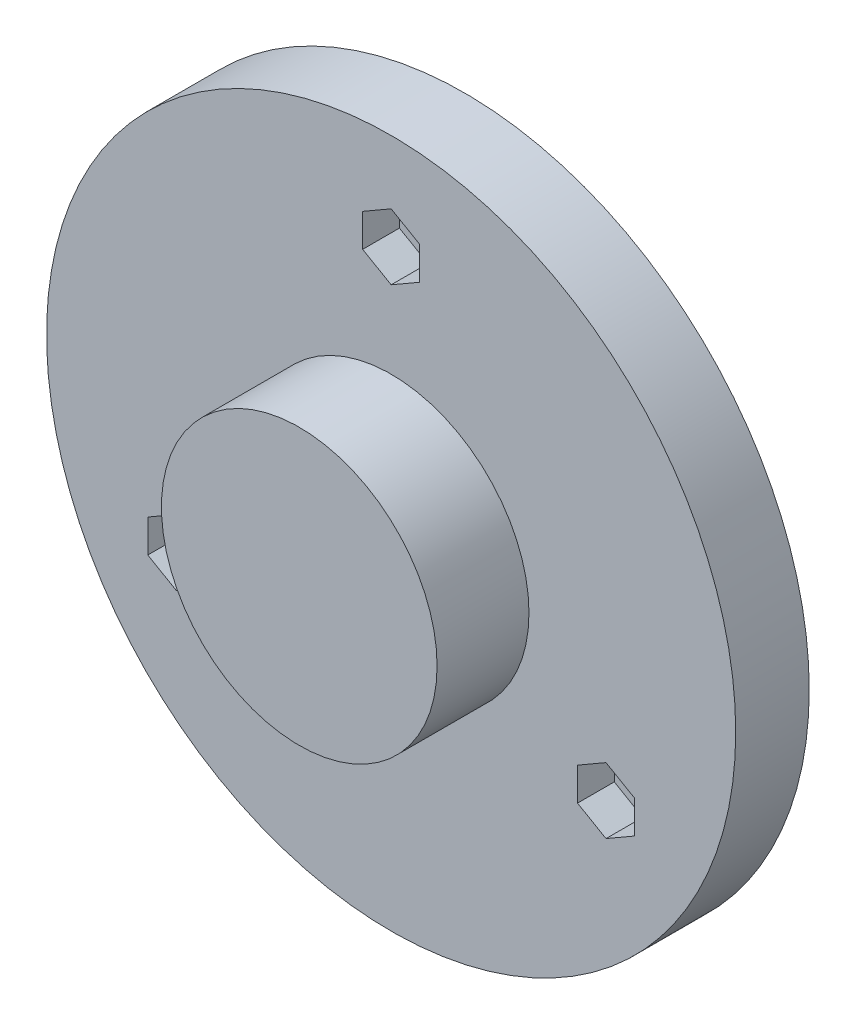
ISO-10303-21;
HEADER;
FILE_DESCRIPTION(('STEP AP214'),'2;1');
FILE_NAME('part.step','',(''),(''),'','','');
FILE_SCHEMA(('AUTOMOTIVE_DESIGN { 1 0 10303 214 1 1 1 1 }'));
ENDSEC;
DATA;
#1=APPLICATION_CONTEXT('core data for automotive mechanical design processes');
#2=APPLICATION_PROTOCOL_DEFINITION('international standard','automotive_design',2000,#1);
#3=PRODUCT_CONTEXT('',#1,'mechanical');
#4=PRODUCT('Part','Part','',(#3));
#5=PRODUCT_RELATED_PRODUCT_CATEGORY('part','',(#4));
#6=PRODUCT_DEFINITION_FORMATION('','',#4);
#7=PRODUCT_DEFINITION_CONTEXT('part definition',#1,'design');
#8=PRODUCT_DEFINITION('design','',#6,#7);
#9=PRODUCT_DEFINITION_SHAPE('','',#8);
#10=(LENGTH_UNIT() NAMED_UNIT(*) SI_UNIT(.MILLI.,.METRE.));
#11=(NAMED_UNIT(*) PLANE_ANGLE_UNIT() SI_UNIT($,.RADIAN.));
#12=(NAMED_UNIT(*) SI_UNIT($,.STERADIAN.) SOLID_ANGLE_UNIT());
#13=UNCERTAINTY_MEASURE_WITH_UNIT(LENGTH_MEASURE(1.E-05),#10,'distance_accuracy_value','');
#14=(GEOMETRIC_REPRESENTATION_CONTEXT(3) GLOBAL_UNCERTAINTY_ASSIGNED_CONTEXT((#13)) GLOBAL_UNIT_ASSIGNED_CONTEXT((#10,
#11,#12)) REPRESENTATION_CONTEXT('',''));
#15=CARTESIAN_POINT('',(0.,0.,0.));
#16=DIRECTION('',(0.,0.,1.));
#17=DIRECTION('',(1.,0.,0.));
#18=AXIS2_PLACEMENT_3D('',#15,#16,#17);
#19=CARTESIAN_POINT('',(0.,0.,8.));
#20=DIRECTION('',(0.,0.,-1.));
#21=DIRECTION('',(-1.,0.,0.));
#22=AXIS2_PLACEMENT_3D('',#19,#20,#21);
#23=CYLINDRICAL_SURFACE('',#22,37.5);
#24=CARTESIAN_POINT('',(0.,0.,8.));
#25=DIRECTION('',(0.,0.,1.));
#26=DIRECTION('',(1.,0.,0.));
#27=AXIS2_PLACEMENT_3D('',#24,#25,#26);
#28=CIRCLE('',#27,37.5);
#29=CARTESIAN_POINT('',(37.5,0.,8.));
#30=VERTEX_POINT('',#29);
#31=EDGE_CURVE('E48',#30,#30,#28,.T.);
#32=ORIENTED_EDGE('',*,*,#31,.F.);
#33=EDGE_LOOP('',(#32));
#34=FACE_BOUND('',#33,.T.);
#35=CARTESIAN_POINT('',(0.,0.,0.));
#36=DIRECTION('',(0.,0.,1.));
#37=DIRECTION('',(1.,0.,0.));
#38=AXIS2_PLACEMENT_3D('',#35,#36,#37);
#39=CIRCLE('',#38,37.5);
#40=CARTESIAN_POINT('',(37.5,0.,0.));
#41=VERTEX_POINT('',#40);
#42=EDGE_CURVE('E357',#41,#41,#39,.T.);
#43=ORIENTED_EDGE('',*,*,#42,.T.);
#44=EDGE_LOOP('',(#43));
#45=FACE_BOUND('',#44,.T.);
#46=ADVANCED_FACE('F39',(#34,#45),#23,.T.);
#47=CARTESIAN_POINT('',(0.,0.,8.));
#48=DIRECTION('',(0.,0.,1.));
#49=DIRECTION('',(1.,0.,0.));
#50=AXIS2_PLACEMENT_3D('',#47,#48,#49);
#51=PLANE('',#50);
#52=CARTESIAN_POINT('',(0.,0.,8.));
#53=DIRECTION('',(0.,0.,1.));
#54=DIRECTION('',(1.,0.,0.));
#55=AXIS2_PLACEMENT_3D('',#52,#53,#54);
#56=CIRCLE('',#55,15.);
#57=CARTESIAN_POINT('',(15.,0.,8.));
#58=VERTEX_POINT('',#57);
#59=EDGE_CURVE('E11',#58,#58,#56,.T.);
#60=ORIENTED_EDGE('',*,*,#59,.F.);
#61=EDGE_LOOP('',(#60));
#62=FACE_BOUND('',#61,.T.);
#63=DIRECTION('',(0.,1.,0.));
#64=VECTOR('',#63,1.);
#65=CARTESIAN_POINT('',(-20.2823149566315,-15.2900000000001,8.));
#66=LINE('',#65,#64);
#67=CARTESIAN_POINT('',(-20.2823149566315,-15.2900000000001,8.));
#68=VERTEX_POINT('',#67);
#69=CARTESIAN_POINT('',(-20.2823149566315,-11.7100000000001,8.));
#70=VERTEX_POINT('',#69);
#71=EDGE_CURVE('E56',#68,#70,#66,.T.);
#72=ORIENTED_EDGE('',*,*,#71,.F.);
#73=DIRECTION('',(0.866025403784437,0.500000000000004,0.));
#74=VECTOR('',#73,1.);
#75=CARTESIAN_POINT('',(-23.3826859021798,-17.0800000000001,8.));
#76=LINE('',#75,#74);
#77=CARTESIAN_POINT('',(-23.3826859021798,-17.0800000000001,8.));
#78=VERTEX_POINT('',#77);
#79=EDGE_CURVE('E190',#78,#68,#76,.T.);
#80=ORIENTED_EDGE('',*,*,#79,.F.);
#81=DIRECTION('',(0.866025403784441,-0.499999999999996,0.));
#82=VECTOR('',#81,1.);
#83=CARTESIAN_POINT('',(-26.4830568477281,-15.2900000000001,8.));
#84=LINE('',#83,#82);
#85=CARTESIAN_POINT('',(-26.4830568477281,-15.2900000000001,8.));
#86=VERTEX_POINT('',#85);
#87=EDGE_CURVE('E194',#86,#78,#84,.T.);
#88=ORIENTED_EDGE('',*,*,#87,.F.);
#89=DIRECTION('',(0.,-1.,0.));
#90=VECTOR('',#89,1.);
#91=CARTESIAN_POINT('',(-26.4830568477281,-11.7100000000001,8.));
#92=LINE('',#91,#90);
#93=CARTESIAN_POINT('',(-26.4830568477281,-11.7100000000001,8.));
#94=VERTEX_POINT('',#93);
#95=EDGE_CURVE('E221',#94,#86,#92,.T.);
#96=ORIENTED_EDGE('',*,*,#95,.F.);
#97=DIRECTION('',(-0.866025403784436,-0.500000000000004,0.));
#98=VECTOR('',#97,1.);
#99=CARTESIAN_POINT('',(-23.3826859021798,-9.92000000000011,8.));
#100=LINE('',#99,#98);
#101=CARTESIAN_POINT('',(-23.3826859021798,-9.92000000000011,8.));
#102=VERTEX_POINT('',#101);
#103=EDGE_CURVE('E217',#102,#94,#100,.T.);
#104=ORIENTED_EDGE('',*,*,#103,.F.);
#105=DIRECTION('',(-0.866025403784441,0.499999999999995,0.));
#106=VECTOR('',#105,1.);
#107=CARTESIAN_POINT('',(-20.2823149566315,-11.7100000000001,8.));
#108=LINE('',#107,#106);
#109=EDGE_CURVE('E213',#70,#102,#108,.T.);
#110=ORIENTED_EDGE('',*,*,#109,.F.);
#111=EDGE_LOOP('',(#72,#80,#88,#96,#104,#110));
#112=FACE_BOUND('',#111,.T.);
#113=DIRECTION('',(-0.866025403784434,-0.500000000000008,0.));
#114=VECTOR('',#113,1.);
#115=CARTESIAN_POINT('',(23.3826859021799,-9.91999999999978,8.));
#116=LINE('',#115,#114);
#117=CARTESIAN_POINT('',(23.3826859021799,-9.91999999999978,8.));
#118=VERTEX_POINT('',#117);
#119=CARTESIAN_POINT('',(20.2823149566317,-11.7099999999998,8.));
#120=VERTEX_POINT('',#119);
#121=EDGE_CURVE('E64',#118,#120,#116,.T.);
#122=ORIENTED_EDGE('',*,*,#121,.F.);
#123=DIRECTION('',(-0.866025403784443,0.499999999999992,0.));
#124=VECTOR('',#123,1.);
#125=CARTESIAN_POINT('',(26.4830568477282,-11.7099999999998,8.));
#126=LINE('',#125,#124);
#127=CARTESIAN_POINT('',(26.4830568477282,-11.7099999999998,8.));
#128=VERTEX_POINT('',#127);
#129=EDGE_CURVE('E248',#128,#118,#126,.T.);
#130=ORIENTED_EDGE('',*,*,#129,.F.);
#131=DIRECTION('',(0.,1.,0.));
#132=VECTOR('',#131,1.);
#133=CARTESIAN_POINT('',(26.4830568477283,-15.2899999999998,8.));
#134=LINE('',#133,#132);
#135=CARTESIAN_POINT('',(26.4830568477283,-15.2899999999998,8.));
#136=VERTEX_POINT('',#135);
#137=EDGE_CURVE('E284',#136,#128,#134,.T.);
#138=ORIENTED_EDGE('',*,*,#137,.F.);
#139=DIRECTION('',(0.866025403784434,0.500000000000008,0.));
#140=VECTOR('',#139,1.);
#141=CARTESIAN_POINT('',(23.38268590218,-17.0799999999998,8.));
#142=LINE('',#141,#140);
#143=CARTESIAN_POINT('',(23.38268590218,-17.0799999999998,8.));
#144=VERTEX_POINT('',#143);
#145=EDGE_CURVE('E280',#144,#136,#142,.T.);
#146=ORIENTED_EDGE('',*,*,#145,.F.);
#147=DIRECTION('',(0.866025403784443,-0.499999999999992,0.));
#148=VECTOR('',#147,1.);
#149=CARTESIAN_POINT('',(20.2823149566317,-15.2899999999998,8.));
#150=LINE('',#149,#148);
#151=CARTESIAN_POINT('',(20.2823149566317,-15.2899999999998,8.));
#152=VERTEX_POINT('',#151);
#153=EDGE_CURVE('E276',#152,#144,#150,.T.);
#154=ORIENTED_EDGE('',*,*,#153,.F.);
#155=DIRECTION('',(0.,-1.,0.));
#156=VECTOR('',#155,1.);
#157=CARTESIAN_POINT('',(20.2823149566317,-11.7099999999998,8.));
#158=LINE('',#157,#156);
#159=EDGE_CURVE('E271',#120,#152,#158,.T.);
#160=ORIENTED_EDGE('',*,*,#159,.F.);
#161=EDGE_LOOP('',(#122,#130,#138,#146,#154,#160));
#162=FACE_BOUND('',#161,.T.);
#163=DIRECTION('',(0.866025403784438,-0.5,0.));
#164=VECTOR('',#163,1.);
#165=CARTESIAN_POINT('',(-3.10037094554829,25.21,8.));
#166=LINE('',#165,#164);
#167=CARTESIAN_POINT('',(-3.10037094554829,25.21,8.));
#168=VERTEX_POINT('',#167);
#169=CARTESIAN_POINT('',(0.,23.42,8.));
#170=VERTEX_POINT('',#169);
#171=EDGE_CURVE('E231',#168,#170,#166,.T.);
#172=ORIENTED_EDGE('',*,*,#171,.F.);
#173=DIRECTION('',(0.,-1.,0.));
#174=VECTOR('',#173,1.);
#175=CARTESIAN_POINT('',(-3.10037094554829,28.79,8.));
#176=LINE('',#175,#174);
#177=CARTESIAN_POINT('',(-3.10037094554829,28.79,8.));
#178=VERTEX_POINT('',#177);
#179=EDGE_CURVE('E312',#178,#168,#176,.T.);
#180=ORIENTED_EDGE('',*,*,#179,.F.);
#181=DIRECTION('',(-0.866025403784439,-0.5,0.));
#182=VECTOR('',#181,1.);
#183=CARTESIAN_POINT('',(0.,30.58,8.));
#184=LINE('',#183,#182);
#185=CARTESIAN_POINT('',(0.,30.58,8.));
#186=VERTEX_POINT('',#185);
#187=EDGE_CURVE('E347',#186,#178,#184,.T.);
#188=ORIENTED_EDGE('',*,*,#187,.F.);
#189=DIRECTION('',(-0.866025403784439,0.5,0.));
#190=VECTOR('',#189,1.);
#191=CARTESIAN_POINT('',(3.10037094554829,28.79,8.));
#192=LINE('',#191,#190);
#193=CARTESIAN_POINT('',(3.10037094554829,28.79,8.));
#194=VERTEX_POINT('',#193);
#195=EDGE_CURVE('E343',#194,#186,#192,.T.);
#196=ORIENTED_EDGE('',*,*,#195,.F.);
#197=DIRECTION('',(0.,1.,0.));
#198=VECTOR('',#197,1.);
#199=CARTESIAN_POINT('',(3.10037094554829,25.21,8.));
#200=LINE('',#199,#198);
#201=CARTESIAN_POINT('',(3.10037094554829,25.21,8.));
#202=VERTEX_POINT('',#201);
#203=EDGE_CURVE('E339',#202,#194,#200,.T.);
#204=ORIENTED_EDGE('',*,*,#203,.F.);
#205=DIRECTION('',(0.866025403784438,0.500000000000001,0.));
#206=VECTOR('',#205,1.);
#207=CARTESIAN_POINT('',(0.,23.42,8.));
#208=LINE('',#207,#206);
#209=EDGE_CURVE('E335',#170,#202,#208,.T.);
#210=ORIENTED_EDGE('',*,*,#209,.F.);
#211=EDGE_LOOP('',(#172,#180,#188,#196,#204,#210));
#212=FACE_BOUND('',#211,.T.);
#213=ORIENTED_EDGE('',*,*,#31,.T.);
#214=EDGE_LOOP('',(#213));
#215=FACE_BOUND('',#214,.T.);
#216=ADVANCED_FACE('F412',(#62,#112,#162,#212,#215),#51,.T.);
#217=CARTESIAN_POINT('',(0.,0.,0.));
#218=DIRECTION('',(0.,0.,1.));
#219=DIRECTION('',(1.,0.,0.));
#220=AXIS2_PLACEMENT_3D('',#217,#218,#219);
#221=PLANE('',#220);
#222=CARTESIAN_POINT('',(-23.3826859021798,-13.5000000000001,0.));
#223=DIRECTION('',(0.,0.,1.));
#224=DIRECTION('',(1.,0.,0.));
#225=AXIS2_PLACEMENT_3D('',#222,#223,#224);
#226=CIRCLE('',#225,1.75);
#227=CARTESIAN_POINT('',(-21.6326859021798,-13.5000000000001,0.));
#228=VERTEX_POINT('',#227);
#229=EDGE_CURVE('E42',#228,#228,#226,.T.);
#230=ORIENTED_EDGE('',*,*,#229,.T.);
#231=EDGE_LOOP('',(#230));
#232=FACE_BOUND('',#231,.T.);
#233=CARTESIAN_POINT('',(23.38268590218,-13.4999999999998,0.));
#234=DIRECTION('',(0.,0.,1.));
#235=DIRECTION('',(1.,0.,0.));
#236=AXIS2_PLACEMENT_3D('',#233,#234,#235);
#237=CIRCLE('',#236,1.75);
#238=CARTESIAN_POINT('',(25.13268590218,-13.4999999999998,0.));
#239=VERTEX_POINT('',#238);
#240=EDGE_CURVE('E381',#239,#239,#237,.T.);
#241=ORIENTED_EDGE('',*,*,#240,.T.);
#242=EDGE_LOOP('',(#241));
#243=FACE_BOUND('',#242,.T.);
#244=CARTESIAN_POINT('',(0.,27.,0.));
#245=DIRECTION('',(0.,0.,1.));
#246=DIRECTION('',(1.,0.,0.));
#247=AXIS2_PLACEMENT_3D('',#244,#245,#246);
#248=CIRCLE('',#247,1.75);
#249=CARTESIAN_POINT('',(1.75,27.,0.));
#250=VERTEX_POINT('',#249);
#251=EDGE_CURVE('E272',#250,#250,#248,.T.);
#252=ORIENTED_EDGE('',*,*,#251,.T.);
#253=EDGE_LOOP('',(#252));
#254=FACE_BOUND('',#253,.T.);
#255=ORIENTED_EDGE('',*,*,#42,.F.);
#256=EDGE_LOOP('',(#255));
#257=FACE_BOUND('',#256,.T.);
#258=ADVANCED_FACE('F415',(#232,#243,#254,#257),#221,.F.);
#259=CARTESIAN_POINT('',(-3.10037094554829,25.21,4.));
#260=DIRECTION('',(-0.5,-0.866025403784438,0.));
#261=DIRECTION('',(0.866025403784438,-0.5,0.));
#262=AXIS2_PLACEMENT_3D('',#259,#260,#261);
#263=PLANE('',#262);
#264=ORIENTED_EDGE('',*,*,#171,.T.);
#265=DIRECTION('',(0.,0.,1.));
#266=VECTOR('',#265,1.);
#267=CARTESIAN_POINT('',(0.,23.42,4.));
#268=LINE('',#267,#266);
#269=CARTESIAN_POINT('',(0.,23.42,4.));
#270=VERTEX_POINT('',#269);
#271=EDGE_CURVE('E332',#270,#170,#268,.T.);
#272=ORIENTED_EDGE('',*,*,#271,.F.);
#273=DIRECTION('',(0.866025403784438,-0.5,0.));
#274=VECTOR('',#273,1.);
#275=CARTESIAN_POINT('',(-3.10037094554829,25.21,4.));
#276=LINE('',#275,#274);
#277=CARTESIAN_POINT('',(-3.10037094554829,25.21,4.));
#278=VERTEX_POINT('',#277);
#279=EDGE_CURVE('E307',#278,#270,#276,.T.);
#280=ORIENTED_EDGE('',*,*,#279,.F.);
#281=DIRECTION('',(0.,0.,1.));
#282=VECTOR('',#281,1.);
#283=CARTESIAN_POINT('',(-3.10037094554829,25.21,4.));
#284=LINE('',#283,#282);
#285=EDGE_CURVE('E354',#278,#168,#284,.T.);
#286=ORIENTED_EDGE('',*,*,#285,.T.);
#287=EDGE_LOOP('',(#264,#272,#280,#286));
#288=FACE_BOUND('',#287,.T.);
#289=ADVANCED_FACE('F433',(#288),#263,.F.);
#290=CARTESIAN_POINT('',(-3.10037094554829,28.79,4.));
#291=DIRECTION('',(-1.,0.,0.));
#292=DIRECTION('',(0.,-1.,0.));
#293=AXIS2_PLACEMENT_3D('',#290,#291,#292);
#294=PLANE('',#293);
#295=ORIENTED_EDGE('',*,*,#179,.T.);
#296=ORIENTED_EDGE('',*,*,#285,.F.);
#297=DIRECTION('',(0.,-1.,0.));
#298=VECTOR('',#297,1.);
#299=CARTESIAN_POINT('',(-3.10037094554829,28.79,4.));
#300=LINE('',#299,#298);
#301=CARTESIAN_POINT('',(-3.10037094554829,28.79,4.));
#302=VERTEX_POINT('',#301);
#303=EDGE_CURVE('E328',#302,#278,#300,.T.);
#304=ORIENTED_EDGE('',*,*,#303,.F.);
#305=DIRECTION('',(0.,0.,1.));
#306=VECTOR('',#305,1.);
#307=CARTESIAN_POINT('',(-3.10037094554829,28.79,4.));
#308=LINE('',#307,#306);
#309=EDGE_CURVE('E358',#302,#178,#308,.T.);
#310=ORIENTED_EDGE('',*,*,#309,.T.);
#311=EDGE_LOOP('',(#295,#296,#304,#310));
#312=FACE_BOUND('',#311,.T.);
#313=ADVANCED_FACE('F438',(#312),#294,.F.);
#314=CARTESIAN_POINT('',(0.,30.58,4.));
#315=DIRECTION('',(-0.5,0.866025403784439,0.));
#316=DIRECTION('',(-0.866025403784439,-0.5,0.));
#317=AXIS2_PLACEMENT_3D('',#314,#315,#316);
#318=PLANE('',#317);
#319=ORIENTED_EDGE('',*,*,#187,.T.);
#320=ORIENTED_EDGE('',*,*,#309,.F.);
#321=DIRECTION('',(-0.866025403784439,-0.5,0.));
#322=VECTOR('',#321,1.);
#323=CARTESIAN_POINT('',(0.,30.58,4.));
#324=LINE('',#323,#322);
#325=CARTESIAN_POINT('',(0.,30.58,4.));
#326=VERTEX_POINT('',#325);
#327=EDGE_CURVE('E324',#326,#302,#324,.T.);
#328=ORIENTED_EDGE('',*,*,#327,.F.);
#329=DIRECTION('',(0.,0.,1.));
#330=VECTOR('',#329,1.);
#331=CARTESIAN_POINT('',(0.,30.58,4.));
#332=LINE('',#331,#330);
#333=EDGE_CURVE('E361',#326,#186,#332,.T.);
#334=ORIENTED_EDGE('',*,*,#333,.T.);
#335=EDGE_LOOP('',(#319,#320,#328,#334));
#336=FACE_BOUND('',#335,.T.);
#337=ADVANCED_FACE('F454',(#336),#318,.F.);
#338=CARTESIAN_POINT('',(3.10037094554829,28.79,4.));
#339=DIRECTION('',(0.5,0.866025403784439,0.));
#340=DIRECTION('',(-0.866025403784439,0.5,0.));
#341=AXIS2_PLACEMENT_3D('',#338,#339,#340);
#342=PLANE('',#341);
#343=ORIENTED_EDGE('',*,*,#195,.T.);
#344=ORIENTED_EDGE('',*,*,#333,.F.);
#345=DIRECTION('',(-0.866025403784439,0.5,0.));
#346=VECTOR('',#345,1.);
#347=CARTESIAN_POINT('',(3.10037094554829,28.79,4.));
#348=LINE('',#347,#346);
#349=CARTESIAN_POINT('',(3.10037094554829,28.79,4.));
#350=VERTEX_POINT('',#349);
#351=EDGE_CURVE('E320',#350,#326,#348,.T.);
#352=ORIENTED_EDGE('',*,*,#351,.F.);
#353=DIRECTION('',(0.,0.,1.));
#354=VECTOR('',#353,1.);
#355=CARTESIAN_POINT('',(3.10037094554829,28.79,4.));
#356=LINE('',#355,#354);
#357=EDGE_CURVE('E364',#350,#194,#356,.T.);
#358=ORIENTED_EDGE('',*,*,#357,.T.);
#359=EDGE_LOOP('',(#343,#344,#352,#358));
#360=FACE_BOUND('',#359,.T.);
#361=ADVANCED_FACE('F450',(#360),#342,.F.);
#362=CARTESIAN_POINT('',(3.10037094554829,25.21,4.));
#363=DIRECTION('',(1.,0.,0.));
#364=DIRECTION('',(0.,0.,-1.));
#365=AXIS2_PLACEMENT_3D('',#362,#363,#364);
#366=PLANE('',#365);
#367=ORIENTED_EDGE('',*,*,#203,.T.);
#368=ORIENTED_EDGE('',*,*,#357,.F.);
#369=DIRECTION('',(0.,1.,0.));
#370=VECTOR('',#369,1.);
#371=CARTESIAN_POINT('',(3.10037094554829,25.21,4.));
#372=LINE('',#371,#370);
#373=CARTESIAN_POINT('',(3.10037094554829,25.21,4.));
#374=VERTEX_POINT('',#373);
#375=EDGE_CURVE('E316',#374,#350,#372,.T.);
#376=ORIENTED_EDGE('',*,*,#375,.F.);
#377=DIRECTION('',(0.,0.,1.));
#378=VECTOR('',#377,1.);
#379=CARTESIAN_POINT('',(3.10037094554829,25.21,4.));
#380=LINE('',#379,#378);
#381=EDGE_CURVE('E367',#374,#202,#380,.T.);
#382=ORIENTED_EDGE('',*,*,#381,.T.);
#383=EDGE_LOOP('',(#367,#368,#376,#382));
#384=FACE_BOUND('',#383,.T.);
#385=ADVANCED_FACE('F446',(#384),#366,.F.);
#386=CARTESIAN_POINT('',(0.,23.42,4.));
#387=DIRECTION('',(0.500000000000001,-0.866025403784438,0.));
#388=DIRECTION('',(0.866025403784438,0.500000000000001,0.));
#389=AXIS2_PLACEMENT_3D('',#386,#387,#388);
#390=PLANE('',#389);
#391=ORIENTED_EDGE('',*,*,#209,.T.);
#392=ORIENTED_EDGE('',*,*,#381,.F.);
#393=DIRECTION('',(0.866025403784438,0.500000000000001,0.));
#394=VECTOR('',#393,1.);
#395=CARTESIAN_POINT('',(0.,23.42,4.));
#396=LINE('',#395,#394);
#397=EDGE_CURVE('E311',#270,#374,#396,.T.);
#398=ORIENTED_EDGE('',*,*,#397,.F.);
#399=ORIENTED_EDGE('',*,*,#271,.T.);
#400=EDGE_LOOP('',(#391,#392,#398,#399));
#401=FACE_BOUND('',#400,.T.);
#402=ADVANCED_FACE('F442',(#401),#390,.F.);
#403=CARTESIAN_POINT('',(0.,0.,4.));
#404=DIRECTION('',(0.,0.,1.));
#405=DIRECTION('',(1.,0.,0.));
#406=AXIS2_PLACEMENT_3D('',#403,#404,#405);
#407=PLANE('',#406);
#408=CARTESIAN_POINT('',(0.,27.,4.));
#409=DIRECTION('',(0.,0.,1.));
#410=DIRECTION('',(1.,0.,0.));
#411=AXIS2_PLACEMENT_3D('',#408,#409,#410);
#412=CIRCLE('',#411,1.75);
#413=CARTESIAN_POINT('',(1.75,27.,4.));
#414=VERTEX_POINT('',#413);
#415=EDGE_CURVE('E197',#414,#414,#412,.T.);
#416=ORIENTED_EDGE('',*,*,#415,.F.);
#417=EDGE_LOOP('',(#416));
#418=FACE_BOUND('',#417,.T.);
#419=ORIENTED_EDGE('',*,*,#279,.T.);
#420=ORIENTED_EDGE('',*,*,#397,.T.);
#421=ORIENTED_EDGE('',*,*,#375,.T.);
#422=ORIENTED_EDGE('',*,*,#351,.T.);
#423=ORIENTED_EDGE('',*,*,#327,.T.);
#424=ORIENTED_EDGE('',*,*,#303,.T.);
#425=EDGE_LOOP('',(#419,#420,#421,#422,#423,#424));
#426=FACE_BOUND('',#425,.T.);
#427=ADVANCED_FACE('F445',(#418,#426),#407,.T.);
#428=CARTESIAN_POINT('',(23.3826859021799,-9.91999999999978,4.));
#429=DIRECTION('',(-0.500000000000008,0.866025403784434,0.));
#430=DIRECTION('',(-0.866025403784434,-0.500000000000008,0.));
#431=AXIS2_PLACEMENT_3D('',#428,#429,#430);
#432=PLANE('',#431);
#433=ORIENTED_EDGE('',*,*,#121,.T.);
#434=DIRECTION('',(0.,0.,1.));
#435=VECTOR('',#434,1.);
#436=CARTESIAN_POINT('',(20.2823149566317,-11.7099999999998,4.));
#437=LINE('',#436,#435);
#438=CARTESIAN_POINT('',(20.2823149566317,-11.7099999999998,4.));
#439=VERTEX_POINT('',#438);
#440=EDGE_CURVE('E268',#439,#120,#437,.T.);
#441=ORIENTED_EDGE('',*,*,#440,.F.);
#442=DIRECTION('',(-0.866025403784434,-0.500000000000008,0.));
#443=VECTOR('',#442,1.);
#444=CARTESIAN_POINT('',(23.3826859021799,-9.91999999999978,4.));
#445=LINE('',#444,#443);
#446=CARTESIAN_POINT('',(23.3826859021799,-9.91999999999978,4.));
#447=VERTEX_POINT('',#446);
#448=EDGE_CURVE('E243',#447,#439,#445,.T.);
#449=ORIENTED_EDGE('',*,*,#448,.F.);
#450=DIRECTION('',(0.,0.,1.));
#451=VECTOR('',#450,1.);
#452=CARTESIAN_POINT('',(23.3826859021799,-9.91999999999978,4.));
#453=LINE('',#452,#451);
#454=EDGE_CURVE('E214',#447,#118,#453,.T.);
#455=ORIENTED_EDGE('',*,*,#454,.T.);
#456=EDGE_LOOP('',(#433,#441,#449,#455));
#457=FACE_BOUND('',#456,.T.);
#458=ADVANCED_FACE('F464',(#457),#432,.F.);
#459=CARTESIAN_POINT('',(26.4830568477282,-11.7099999999998,4.));
#460=DIRECTION('',(0.499999999999992,0.866025403784443,0.));
#461=DIRECTION('',(-0.866025403784443,0.499999999999992,0.));
#462=AXIS2_PLACEMENT_3D('',#459,#460,#461);
#463=PLANE('',#462);
#464=ORIENTED_EDGE('',*,*,#129,.T.);
#465=ORIENTED_EDGE('',*,*,#454,.F.);
#466=DIRECTION('',(-0.866025403784443,0.499999999999992,0.));
#467=VECTOR('',#466,1.);
#468=CARTESIAN_POINT('',(26.4830568477282,-11.7099999999998,4.));
#469=LINE('',#468,#467);
#470=CARTESIAN_POINT('',(26.4830568477282,-11.7099999999998,4.));
#471=VERTEX_POINT('',#470);
#472=EDGE_CURVE('E264',#471,#447,#469,.T.);
#473=ORIENTED_EDGE('',*,*,#472,.F.);
#474=DIRECTION('',(0.,0.,1.));
#475=VECTOR('',#474,1.);
#476=CARTESIAN_POINT('',(26.4830568477282,-11.7099999999998,4.));
#477=LINE('',#476,#475);
#478=EDGE_CURVE('E293',#471,#128,#477,.T.);
#479=ORIENTED_EDGE('',*,*,#478,.T.);
#480=EDGE_LOOP('',(#464,#465,#473,#479));
#481=FACE_BOUND('',#480,.T.);
#482=ADVANCED_FACE('F468',(#481),#463,.F.);
#483=CARTESIAN_POINT('',(26.4830568477283,-15.2899999999998,4.));
#484=DIRECTION('',(1.,0.,0.));
#485=DIRECTION('',(0.,1.,0.));
#486=AXIS2_PLACEMENT_3D('',#483,#484,#485);
#487=PLANE('',#486);
#488=ORIENTED_EDGE('',*,*,#137,.T.);
#489=ORIENTED_EDGE('',*,*,#478,.F.);
#490=DIRECTION('',(0.,1.,0.));
#491=VECTOR('',#490,1.);
#492=CARTESIAN_POINT('',(26.4830568477283,-15.2899999999998,4.));
#493=LINE('',#492,#491);
#494=CARTESIAN_POINT('',(26.4830568477283,-15.2899999999998,4.));
#495=VERTEX_POINT('',#494);
#496=EDGE_CURVE('E260',#495,#471,#493,.T.);
#497=ORIENTED_EDGE('',*,*,#496,.F.);
#498=DIRECTION('',(0.,0.,1.));
#499=VECTOR('',#498,1.);
#500=CARTESIAN_POINT('',(26.4830568477283,-15.2899999999998,4.));
#501=LINE('',#500,#499);
#502=EDGE_CURVE('E296',#495,#136,#501,.T.);
#503=ORIENTED_EDGE('',*,*,#502,.T.);
#504=EDGE_LOOP('',(#488,#489,#497,#503));
#505=FACE_BOUND('',#504,.T.);
#506=ADVANCED_FACE('F481',(#505),#487,.F.);
#507=CARTESIAN_POINT('',(23.38268590218,-17.0799999999998,4.));
#508=DIRECTION('',(0.500000000000008,-0.866025403784434,0.));
#509=DIRECTION('',(0.866025403784434,0.500000000000008,0.));
#510=AXIS2_PLACEMENT_3D('',#507,#508,#509);
#511=PLANE('',#510);
#512=ORIENTED_EDGE('',*,*,#145,.T.);
#513=ORIENTED_EDGE('',*,*,#502,.F.);
#514=DIRECTION('',(0.866025403784434,0.500000000000008,0.));
#515=VECTOR('',#514,1.);
#516=CARTESIAN_POINT('',(23.38268590218,-17.0799999999998,4.));
#517=LINE('',#516,#515);
#518=CARTESIAN_POINT('',(23.38268590218,-17.0799999999998,4.));
#519=VERTEX_POINT('',#518);
#520=EDGE_CURVE('E256',#519,#495,#517,.T.);
#521=ORIENTED_EDGE('',*,*,#520,.F.);
#522=DIRECTION('',(0.,0.,1.));
#523=VECTOR('',#522,1.);
#524=CARTESIAN_POINT('',(23.38268590218,-17.0799999999998,4.));
#525=LINE('',#524,#523);
#526=EDGE_CURVE('E299',#519,#144,#525,.T.);
#527=ORIENTED_EDGE('',*,*,#526,.T.);
#528=EDGE_LOOP('',(#512,#513,#521,#527));
#529=FACE_BOUND('',#528,.T.);
#530=ADVANCED_FACE('F477',(#529),#511,.F.);
#531=CARTESIAN_POINT('',(20.2823149566317,-15.2899999999998,4.));
#532=DIRECTION('',(-0.499999999999992,-0.866025403784443,0.));
#533=DIRECTION('',(0.866025403784443,-0.499999999999992,0.));
#534=AXIS2_PLACEMENT_3D('',#531,#532,#533);
#535=PLANE('',#534);
#536=ORIENTED_EDGE('',*,*,#153,.T.);
#537=ORIENTED_EDGE('',*,*,#526,.F.);
#538=DIRECTION('',(0.866025403784443,-0.499999999999992,0.));
#539=VECTOR('',#538,1.);
#540=CARTESIAN_POINT('',(20.2823149566317,-15.2899999999998,4.));
#541=LINE('',#540,#539);
#542=CARTESIAN_POINT('',(20.2823149566317,-15.2899999999998,4.));
#543=VERTEX_POINT('',#542);
#544=EDGE_CURVE('E252',#543,#519,#541,.T.);
#545=ORIENTED_EDGE('',*,*,#544,.F.);
#546=DIRECTION('',(0.,0.,1.));
#547=VECTOR('',#546,1.);
#548=CARTESIAN_POINT('',(20.2823149566317,-15.2899999999998,4.));
#549=LINE('',#548,#547);
#550=EDGE_CURVE('E302',#543,#152,#549,.T.);
#551=ORIENTED_EDGE('',*,*,#550,.T.);
#552=EDGE_LOOP('',(#536,#537,#545,#551));
#553=FACE_BOUND('',#552,.T.);
#554=ADVANCED_FACE('F473',(#553),#535,.F.);
#555=CARTESIAN_POINT('',(20.2823149566317,-11.7099999999998,4.));
#556=DIRECTION('',(-1.,0.,0.));
#557=DIRECTION('',(0.,-1.,0.));
#558=AXIS2_PLACEMENT_3D('',#555,#556,#557);
#559=PLANE('',#558);
#560=ORIENTED_EDGE('',*,*,#159,.T.);
#561=ORIENTED_EDGE('',*,*,#550,.F.);
#562=DIRECTION('',(0.,-1.,0.));
#563=VECTOR('',#562,1.);
#564=CARTESIAN_POINT('',(20.2823149566317,-11.7099999999998,4.));
#565=LINE('',#564,#563);
#566=EDGE_CURVE('E247',#439,#543,#565,.T.);
#567=ORIENTED_EDGE('',*,*,#566,.F.);
#568=ORIENTED_EDGE('',*,*,#440,.T.);
#569=EDGE_LOOP('',(#560,#561,#567,#568));
#570=FACE_BOUND('',#569,.T.);
#571=ADVANCED_FACE('F469',(#570),#559,.F.);
#572=CARTESIAN_POINT('',(0.,0.,4.));
#573=DIRECTION('',(0.,0.,1.));
#574=DIRECTION('',(-0.499999999999992,-0.866025403784443,0.));
#575=AXIS2_PLACEMENT_3D('',#572,#573,#574);
#576=PLANE('',#575);
#577=CARTESIAN_POINT('',(23.38268590218,-13.4999999999998,4.));
#578=DIRECTION('',(0.,0.,1.));
#579=DIRECTION('',(-0.499999999999992,-0.866025403784443,0.));
#580=AXIS2_PLACEMENT_3D('',#577,#578,#579);
#581=CIRCLE('',#580,1.75);
#582=CARTESIAN_POINT('',(22.50768590218,-15.0155444566226,4.));
#583=VERTEX_POINT('',#582);
#584=EDGE_CURVE('E391',#583,#583,#581,.T.);
#585=ORIENTED_EDGE('',*,*,#584,.F.);
#586=EDGE_LOOP('',(#585));
#587=FACE_BOUND('',#586,.T.);
#588=ORIENTED_EDGE('',*,*,#448,.T.);
#589=ORIENTED_EDGE('',*,*,#566,.T.);
#590=ORIENTED_EDGE('',*,*,#544,.T.);
#591=ORIENTED_EDGE('',*,*,#520,.T.);
#592=ORIENTED_EDGE('',*,*,#496,.T.);
#593=ORIENTED_EDGE('',*,*,#472,.T.);
#594=EDGE_LOOP('',(#588,#589,#590,#591,#592,#593));
#595=FACE_BOUND('',#594,.T.);
#596=ADVANCED_FACE('F472',(#587,#595),#576,.T.);
#597=CARTESIAN_POINT('',(-20.2823149566315,-15.2900000000001,4.));
#598=DIRECTION('',(1.,0.,0.));
#599=DIRECTION('',(0.,1.,0.));
#600=AXIS2_PLACEMENT_3D('',#597,#598,#599);
#601=PLANE('',#600);
#602=ORIENTED_EDGE('',*,*,#71,.T.);
#603=DIRECTION('',(0.,0.,1.));
#604=VECTOR('',#603,1.);
#605=CARTESIAN_POINT('',(-20.2823149566315,-11.7100000000001,4.));
#606=LINE('',#605,#604);
#607=CARTESIAN_POINT('',(-20.2823149566315,-11.7100000000001,4.));
#608=VERTEX_POINT('',#607);
#609=EDGE_CURVE('E164',#608,#70,#606,.T.);
#610=ORIENTED_EDGE('',*,*,#609,.F.);
#611=DIRECTION('',(0.,1.,0.));
#612=VECTOR('',#611,1.);
#613=CARTESIAN_POINT('',(-20.2823149566315,-15.2900000000001,4.));
#614=LINE('',#613,#612);
#615=CARTESIAN_POINT('',(-20.2823149566315,-15.2900000000001,4.));
#616=VERTEX_POINT('',#615);
#617=EDGE_CURVE('E168',#616,#608,#614,.T.);
#618=ORIENTED_EDGE('',*,*,#617,.F.);
#619=DIRECTION('',(0.,0.,1.));
#620=VECTOR('',#619,1.);
#621=CARTESIAN_POINT('',(-20.2823149566315,-15.2900000000001,4.));
#622=LINE('',#621,#620);
#623=EDGE_CURVE('E228',#616,#68,#622,.T.);
#624=ORIENTED_EDGE('',*,*,#623,.T.);
#625=EDGE_LOOP('',(#602,#610,#618,#624));
#626=FACE_BOUND('',#625,.T.);
#627=ADVANCED_FACE('F166',(#626),#601,.F.);
#628=CARTESIAN_POINT('',(-23.3826859021798,-17.0800000000001,4.));
#629=DIRECTION('',(0.500000000000004,-0.866025403784436,0.));
#630=DIRECTION('',(0.866025403784436,0.500000000000004,0.));
#631=AXIS2_PLACEMENT_3D('',#628,#629,#630);
#632=PLANE('',#631);
#633=ORIENTED_EDGE('',*,*,#79,.T.);
#634=ORIENTED_EDGE('',*,*,#623,.F.);
#635=DIRECTION('',(0.866025403784437,0.500000000000004,0.));
#636=VECTOR('',#635,1.);
#637=CARTESIAN_POINT('',(-23.3826859021798,-17.0800000000001,4.));
#638=LINE('',#637,#636);
#639=CARTESIAN_POINT('',(-23.3826859021798,-17.0800000000001,4.));
#640=VERTEX_POINT('',#639);
#641=EDGE_CURVE('E175',#640,#616,#638,.T.);
#642=ORIENTED_EDGE('',*,*,#641,.F.);
#643=DIRECTION('',(0.,0.,1.));
#644=VECTOR('',#643,1.);
#645=CARTESIAN_POINT('',(-23.3826859021798,-17.0800000000001,4.));
#646=LINE('',#645,#644);
#647=EDGE_CURVE('E232',#640,#78,#646,.T.);
#648=ORIENTED_EDGE('',*,*,#647,.T.);
#649=EDGE_LOOP('',(#633,#634,#642,#648));
#650=FACE_BOUND('',#649,.T.);
#651=ADVANCED_FACE('F494',(#650),#632,.F.);
#652=CARTESIAN_POINT('',(-26.4830568477281,-15.2900000000001,4.));
#653=DIRECTION('',(-0.499999999999996,-0.866025403784441,0.));
#654=DIRECTION('',(0.866025403784441,-0.499999999999996,0.));
#655=AXIS2_PLACEMENT_3D('',#652,#653,#654);
#656=PLANE('',#655);
#657=ORIENTED_EDGE('',*,*,#87,.T.);
#658=ORIENTED_EDGE('',*,*,#647,.F.);
#659=DIRECTION('',(0.866025403784441,-0.499999999999996,0.));
#660=VECTOR('',#659,1.);
#661=CARTESIAN_POINT('',(-26.4830568477281,-15.2900000000001,4.));
#662=LINE('',#661,#660);
#663=CARTESIAN_POINT('',(-26.4830568477281,-15.2900000000001,4.));
#664=VERTEX_POINT('',#663);
#665=EDGE_CURVE('E206',#664,#640,#662,.T.);
#666=ORIENTED_EDGE('',*,*,#665,.F.);
#667=DIRECTION('',(0.,0.,1.));
#668=VECTOR('',#667,1.);
#669=CARTESIAN_POINT('',(-26.4830568477281,-15.2900000000001,4.));
#670=LINE('',#669,#668);
#671=EDGE_CURVE('E235',#664,#86,#670,.T.);
#672=ORIENTED_EDGE('',*,*,#671,.T.);
#673=EDGE_LOOP('',(#657,#658,#666,#672));
#674=FACE_BOUND('',#673,.T.);
#675=ADVANCED_FACE('F504',(#674),#656,.F.);
#676=CARTESIAN_POINT('',(-26.4830568477281,-11.7100000000001,4.));
#677=DIRECTION('',(-1.,0.,0.));
#678=DIRECTION('',(0.,-1.,0.));
#679=AXIS2_PLACEMENT_3D('',#676,#677,#678);
#680=PLANE('',#679);
#681=ORIENTED_EDGE('',*,*,#95,.T.);
#682=ORIENTED_EDGE('',*,*,#671,.F.);
#683=DIRECTION('',(0.,-1.,0.));
#684=VECTOR('',#683,1.);
#685=CARTESIAN_POINT('',(-26.4830568477281,-11.7100000000001,4.));
#686=LINE('',#685,#684);
#687=CARTESIAN_POINT('',(-26.4830568477281,-11.7100000000001,4.));
#688=VERTEX_POINT('',#687);
#689=EDGE_CURVE('E202',#688,#664,#686,.T.);
#690=ORIENTED_EDGE('',*,*,#689,.F.);
#691=DIRECTION('',(0.,0.,1.));
#692=VECTOR('',#691,1.);
#693=CARTESIAN_POINT('',(-26.4830568477281,-11.7100000000001,4.));
#694=LINE('',#693,#692);
#695=EDGE_CURVE('E238',#688,#94,#694,.T.);
#696=ORIENTED_EDGE('',*,*,#695,.T.);
#697=EDGE_LOOP('',(#681,#682,#690,#696));
#698=FACE_BOUND('',#697,.T.);
#699=ADVANCED_FACE('F500',(#698),#680,.F.);
#700=CARTESIAN_POINT('',(-23.3826859021798,-9.92000000000011,4.));
#701=DIRECTION('',(-0.500000000000004,0.866025403784436,0.));
#702=DIRECTION('',(-0.866025403784436,-0.500000000000004,0.));
#703=AXIS2_PLACEMENT_3D('',#700,#701,#702);
#704=PLANE('',#703);
#705=ORIENTED_EDGE('',*,*,#103,.T.);
#706=ORIENTED_EDGE('',*,*,#695,.F.);
#707=DIRECTION('',(-0.866025403784436,-0.500000000000004,0.));
#708=VECTOR('',#707,1.);
#709=CARTESIAN_POINT('',(-23.3826859021798,-9.92000000000011,4.));
#710=LINE('',#709,#708);
#711=CARTESIAN_POINT('',(-23.3826859021798,-9.92000000000011,4.));
#712=VERTEX_POINT('',#711);
#713=EDGE_CURVE('E184',#712,#688,#710,.T.);
#714=ORIENTED_EDGE('',*,*,#713,.F.);
#715=DIRECTION('',(0.,0.,1.));
#716=VECTOR('',#715,1.);
#717=CARTESIAN_POINT('',(-23.3826859021798,-9.92000000000011,4.));
#718=LINE('',#717,#716);
#719=EDGE_CURVE('E174',#712,#102,#718,.T.);
#720=ORIENTED_EDGE('',*,*,#719,.T.);
#721=EDGE_LOOP('',(#705,#706,#714,#720));
#722=FACE_BOUND('',#721,.T.);
#723=ADVANCED_FACE('F497',(#722),#704,.F.);
#724=CARTESIAN_POINT('',(-20.2823149566315,-11.7100000000001,4.));
#725=DIRECTION('',(0.499999999999995,0.866025403784441,0.));
#726=DIRECTION('',(-0.866025403784441,0.499999999999995,0.));
#727=AXIS2_PLACEMENT_3D('',#724,#725,#726);
#728=PLANE('',#727);
#729=ORIENTED_EDGE('',*,*,#109,.T.);
#730=ORIENTED_EDGE('',*,*,#719,.F.);
#731=DIRECTION('',(-0.866025403784441,0.499999999999995,0.));
#732=VECTOR('',#731,1.);
#733=CARTESIAN_POINT('',(-20.2823149566315,-11.7100000000001,4.));
#734=LINE('',#733,#732);
#735=EDGE_CURVE('E178',#608,#712,#734,.T.);
#736=ORIENTED_EDGE('',*,*,#735,.F.);
#737=ORIENTED_EDGE('',*,*,#609,.T.);
#738=EDGE_LOOP('',(#729,#730,#736,#737));
#739=FACE_BOUND('',#738,.T.);
#740=ADVANCED_FACE('F179',(#739),#728,.F.);
#741=CARTESIAN_POINT('',(0.,0.,4.));
#742=DIRECTION('',(0.,0.,1.));
#743=DIRECTION('',(-0.500000000000004,0.866025403784436,0.));
#744=AXIS2_PLACEMENT_3D('',#741,#742,#743);
#745=PLANE('',#744);
#746=CARTESIAN_POINT('',(-23.3826859021798,-13.5000000000001,4.));
#747=DIRECTION('',(0.,0.,1.));
#748=DIRECTION('',(-0.500000000000004,0.866025403784436,0.));
#749=AXIS2_PLACEMENT_3D('',#746,#747,#748);
#750=CIRCLE('',#749,1.75);
#751=CARTESIAN_POINT('',(-24.2576859021798,-11.9844555433773,4.));
#752=VERTEX_POINT('',#751);
#753=EDGE_CURVE('E384',#752,#752,#750,.T.);
#754=ORIENTED_EDGE('',*,*,#753,.F.);
#755=EDGE_LOOP('',(#754));
#756=FACE_BOUND('',#755,.T.);
#757=ORIENTED_EDGE('',*,*,#617,.T.);
#758=ORIENTED_EDGE('',*,*,#735,.T.);
#759=ORIENTED_EDGE('',*,*,#713,.T.);
#760=ORIENTED_EDGE('',*,*,#689,.T.);
#761=ORIENTED_EDGE('',*,*,#665,.T.);
#762=ORIENTED_EDGE('',*,*,#641,.T.);
#763=EDGE_LOOP('',(#757,#758,#759,#760,#761,#762));
#764=FACE_BOUND('',#763,.T.);
#765=ADVANCED_FACE('F186',(#756,#764),#745,.T.);
#766=CARTESIAN_POINT('',(0.,27.,-13.));
#767=DIRECTION('',(0.,0.,1.));
#768=DIRECTION('',(1.,0.,0.));
#769=AXIS2_PLACEMENT_3D('',#766,#767,#768);
#770=CYLINDRICAL_SURFACE('',#769,1.75);
#771=ORIENTED_EDGE('',*,*,#415,.T.);
#772=EDGE_LOOP('',(#771));
#773=FACE_BOUND('',#772,.T.);
#774=ORIENTED_EDGE('',*,*,#251,.F.);
#775=EDGE_LOOP('',(#774));
#776=FACE_BOUND('',#775,.T.);
#777=ADVANCED_FACE('F514',(#773,#776),#770,.F.);
#778=CARTESIAN_POINT('',(23.38268590218,-13.4999999999998,-13.));
#779=DIRECTION('',(0.,0.,1.));
#780=DIRECTION('',(1.,0.,0.));
#781=AXIS2_PLACEMENT_3D('',#778,#779,#780);
#782=CYLINDRICAL_SURFACE('',#781,1.75);
#783=ORIENTED_EDGE('',*,*,#584,.T.);
#784=EDGE_LOOP('',(#783));
#785=FACE_BOUND('',#784,.T.);
#786=ORIENTED_EDGE('',*,*,#240,.F.);
#787=EDGE_LOOP('',(#786));
#788=FACE_BOUND('',#787,.T.);
#789=ADVANCED_FACE('F518',(#785,#788),#782,.F.);
#790=CARTESIAN_POINT('',(-23.3826859021798,-13.5000000000001,-13.));
#791=DIRECTION('',(0.,0.,1.));
#792=DIRECTION('',(1.,0.,0.));
#793=AXIS2_PLACEMENT_3D('',#790,#791,#792);
#794=CYLINDRICAL_SURFACE('',#793,1.75);
#795=ORIENTED_EDGE('',*,*,#753,.T.);
#796=EDGE_LOOP('',(#795));
#797=FACE_BOUND('',#796,.T.);
#798=ORIENTED_EDGE('',*,*,#229,.F.);
#799=EDGE_LOOP('',(#798));
#800=FACE_BOUND('',#799,.T.);
#801=ADVANCED_FACE('F408',(#797,#800),#794,.F.);
#802=CARTESIAN_POINT('',(0.,0.,18.));
#803=DIRECTION('',(0.,0.,-1.));
#804=DIRECTION('',(-1.,0.,0.));
#805=AXIS2_PLACEMENT_3D('',#802,#803,#804);
#806=CYLINDRICAL_SURFACE('',#805,15.);
#807=CARTESIAN_POINT('',(0.,0.,18.));
#808=DIRECTION('',(0.,0.,1.));
#809=DIRECTION('',(1.,0.,0.));
#810=AXIS2_PLACEMENT_3D('',#807,#808,#809);
#811=CIRCLE('',#810,15.);
#812=CARTESIAN_POINT('',(15.,0.,18.));
#813=VERTEX_POINT('',#812);
#814=EDGE_CURVE('E397',#813,#813,#811,.T.);
#815=ORIENTED_EDGE('',*,*,#814,.F.);
#816=EDGE_LOOP('',(#815));
#817=FACE_BOUND('',#816,.T.);
#818=ORIENTED_EDGE('',*,*,#59,.T.);
#819=EDGE_LOOP('',(#818));
#820=FACE_BOUND('',#819,.T.);
#821=ADVANCED_FACE('F405',(#817,#820),#806,.T.);
#822=CARTESIAN_POINT('',(0.,0.,18.));
#823=DIRECTION('',(0.,0.,1.));
#824=DIRECTION('',(1.,0.,0.));
#825=AXIS2_PLACEMENT_3D('',#822,#823,#824);
#826=PLANE('',#825);
#827=ORIENTED_EDGE('',*,*,#814,.T.);
#828=EDGE_LOOP('',(#827));
#829=FACE_BOUND('',#828,.T.);
#830=ADVANCED_FACE('F403',(#829),#826,.T.);
#831=CLOSED_SHELL('',(#46,#216,#258,#289,#313,#337,#361,#385,#402,#427,#458,#482,#506,#530,#554,
#571,#596,#627,#651,#675,#699,#723,#740,#765,#777,#789,#801,#821,#830));
#832=MANIFOLD_SOLID_BREP('B2',#831);
#833=ADVANCED_BREP_SHAPE_REPRESENTATION('',(#18,#832),#14);
#834=SHAPE_DEFINITION_REPRESENTATION(#9,#833);
ENDSEC;
END-ISO-10303-21;
